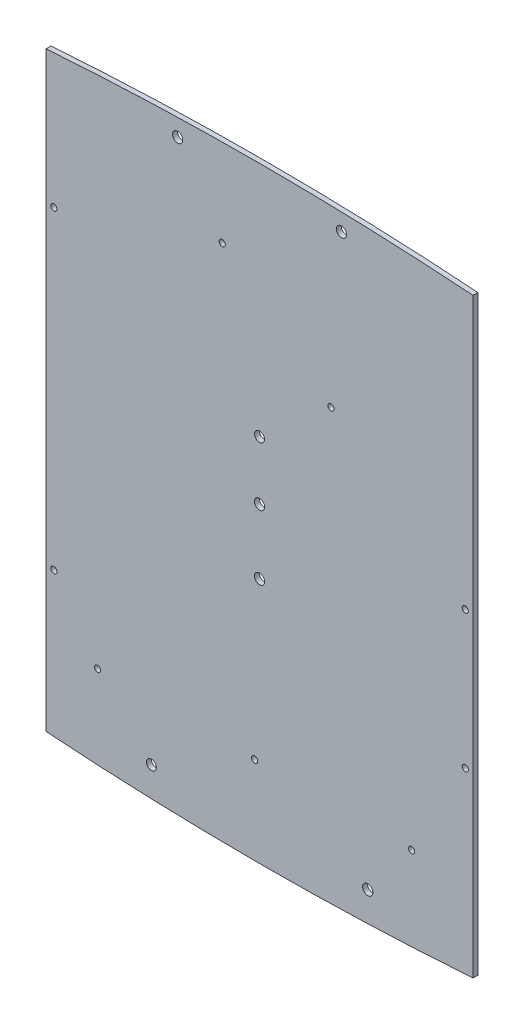
ISO-10303-21;
HEADER;
FILE_DESCRIPTION(('STEP AP214'),'2;1');
FILE_NAME('part.step','',(''),(''),'','','');
FILE_SCHEMA(('AUTOMOTIVE_DESIGN { 1 0 10303 214 1 1 1 1 }'));
ENDSEC;
DATA;
#1=APPLICATION_CONTEXT('core data for automotive mechanical design processes');
#2=APPLICATION_PROTOCOL_DEFINITION('international standard','automotive_design',2000,#1);
#3=PRODUCT_CONTEXT('',#1,'mechanical');
#4=PRODUCT('Part','Part','',(#3));
#5=PRODUCT_RELATED_PRODUCT_CATEGORY('part','',(#4));
#6=PRODUCT_DEFINITION_FORMATION('','',#4);
#7=PRODUCT_DEFINITION_CONTEXT('part definition',#1,'design');
#8=PRODUCT_DEFINITION('design','',#6,#7);
#9=PRODUCT_DEFINITION_SHAPE('','',#8);
#10=(LENGTH_UNIT() NAMED_UNIT(*) SI_UNIT(.MILLI.,.METRE.));
#11=(NAMED_UNIT(*) PLANE_ANGLE_UNIT() SI_UNIT($,.RADIAN.));
#12=(NAMED_UNIT(*) SI_UNIT($,.STERADIAN.) SOLID_ANGLE_UNIT());
#13=UNCERTAINTY_MEASURE_WITH_UNIT(LENGTH_MEASURE(1.E-05),#10,'distance_accuracy_value','');
#14=(GEOMETRIC_REPRESENTATION_CONTEXT(3) GLOBAL_UNCERTAINTY_ASSIGNED_CONTEXT((#13)) GLOBAL_UNIT_ASSIGNED_CONTEXT((#10,
#11,#12)) REPRESENTATION_CONTEXT('',''));
#15=CARTESIAN_POINT('',(0.,0.,0.));
#16=DIRECTION('',(0.,0.,1.));
#17=DIRECTION('',(1.,0.,0.));
#18=AXIS2_PLACEMENT_3D('',#15,#16,#17);
#19=CARTESIAN_POINT('',(0.,1739.49648769427,3.175));
#20=DIRECTION('',(0.,0.,1.));
#21=DIRECTION('',(1.,0.,0.));
#22=AXIS2_PLACEMENT_3D('',#19,#20,#21);
#23=PLANE('',#22);
#24=CARTESIAN_POINT('',(-104.775,-139.446,3.175));
#25=DIRECTION('',(0.,0.,1.));
#26=DIRECTION('',(1.,0.,0.));
#27=AXIS2_PLACEMENT_3D('',#24,#25,#26);
#28=CIRCLE('',#27,2.);
#29=CARTESIAN_POINT('',(-102.775,-139.446,3.175));
#30=VERTEX_POINT('',#29);
#31=EDGE_CURVE('E190',#30,#30,#28,.T.);
#32=ORIENTED_EDGE('',*,*,#31,.F.);
#33=EDGE_LOOP('',(#32));
#34=FACE_BOUND('',#33,.T.);
#35=CARTESIAN_POINT('',(-3.175,-139.446,3.175));
#36=DIRECTION('',(0.,0.,1.));
#37=DIRECTION('',(1.,0.,0.));
#38=AXIS2_PLACEMENT_3D('',#35,#36,#37);
#39=CIRCLE('',#38,2.);
#40=CARTESIAN_POINT('',(-1.175,-139.446,3.175));
#41=VERTEX_POINT('',#40);
#42=EDGE_CURVE('E178',#41,#41,#39,.T.);
#43=ORIENTED_EDGE('',*,*,#42,.F.);
#44=EDGE_LOOP('',(#43));
#45=FACE_BOUND('',#44,.T.);
#46=CARTESIAN_POINT('',(98.425,-139.446,3.175));
#47=DIRECTION('',(0.,0.,1.));
#48=DIRECTION('',(1.,0.,0.));
#49=AXIS2_PLACEMENT_3D('',#46,#47,#48);
#50=CIRCLE('',#49,2.);
#51=CARTESIAN_POINT('',(100.425,-139.446,3.175));
#52=VERTEX_POINT('',#51);
#53=EDGE_CURVE('E166',#52,#52,#50,.T.);
#54=ORIENTED_EDGE('',*,*,#53,.F.);
#55=EDGE_LOOP('',(#54));
#56=FACE_BOUND('',#55,.T.);
#57=CARTESIAN_POINT('',(133.096,12.7,3.175));
#58=DIRECTION('',(0.,0.,1.));
#59=DIRECTION('',(1.,0.,0.));
#60=AXIS2_PLACEMENT_3D('',#57,#58,#59);
#61=CIRCLE('',#60,2.);
#62=CARTESIAN_POINT('',(135.096,12.7,3.175));
#63=VERTEX_POINT('',#62);
#64=EDGE_CURVE('E154',#63,#63,#61,.T.);
#65=ORIENTED_EDGE('',*,*,#64,.F.);
#66=EDGE_LOOP('',(#65));
#67=FACE_BOUND('',#66,.T.);
#68=CARTESIAN_POINT('',(0.,5.15000000000001,3.175));
#69=DIRECTION('',(0.,0.,1.));
#70=DIRECTION('',(1.,0.,0.));
#71=AXIS2_PLACEMENT_3D('',#68,#69,#70);
#72=CIRCLE('',#71,3.3);
#73=CARTESIAN_POINT('',(3.3,5.15000000000001,3.175));
#74=VERTEX_POINT('',#73);
#75=EDGE_CURVE('E142',#74,#74,#72,.T.);
#76=ORIENTED_EDGE('',*,*,#75,.F.);
#77=EDGE_LOOP('',(#76));
#78=FACE_BOUND('',#77,.T.);
#79=CARTESIAN_POINT('',(-52.9999999999992,184.28,3.175));
#80=DIRECTION('',(0.,0.,1.));
#81=DIRECTION('',(1.,0.,0.));
#82=AXIS2_PLACEMENT_3D('',#79,#80,#81);
#83=CIRCLE('',#82,3.3);
#84=CARTESIAN_POINT('',(-49.6999999999992,184.28,3.175));
#85=VERTEX_POINT('',#84);
#86=EDGE_CURVE('E130',#85,#85,#83,.T.);
#87=ORIENTED_EDGE('',*,*,#86,.F.);
#88=EDGE_LOOP('',(#87));
#89=FACE_BOUND('',#88,.T.);
#90=CARTESIAN_POINT('',(-24.13,139.446,3.175));
#91=DIRECTION('',(0.,0.,1.));
#92=DIRECTION('',(1.,0.,0.));
#93=AXIS2_PLACEMENT_3D('',#90,#91,#92);
#94=CIRCLE('',#93,2.);
#95=CARTESIAN_POINT('',(-22.13,139.446,3.175));
#96=VERTEX_POINT('',#95);
#97=EDGE_CURVE('E118',#96,#96,#94,.T.);
#98=ORIENTED_EDGE('',*,*,#97,.F.);
#99=EDGE_LOOP('',(#98));
#100=FACE_BOUND('',#99,.T.);
#101=CARTESIAN_POINT('',(46.1772,82.55,3.175));
#102=DIRECTION('',(0.,0.,1.));
#103=DIRECTION('',(1.,0.,0.));
#104=AXIS2_PLACEMENT_3D('',#101,#102,#103);
#105=CIRCLE('',#104,2.);
#106=CARTESIAN_POINT('',(48.1772,82.55,3.175));
#107=VERTEX_POINT('',#106);
#108=EDGE_CURVE('E97',#107,#107,#105,.T.);
#109=ORIENTED_EDGE('',*,*,#108,.F.);
#110=EDGE_LOOP('',(#109));
#111=FACE_BOUND('',#110,.T.);
#112=CARTESIAN_POINT('',(0.,1739.49648769427,3.175));
#113=DIRECTION('',(0.,0.,1.));
#114=DIRECTION('',(1.,0.,0.));
#115=AXIS2_PLACEMENT_3D('',#112,#113,#114);
#116=CIRCLE('',#115,1935.68);
#117=CARTESIAN_POINT('',(-138.112499999999,-191.25,3.175));
#118=VERTEX_POINT('',#117);
#119=CARTESIAN_POINT('',(138.112500000001,-191.25,3.175));
#120=VERTEX_POINT('',#119);
#121=EDGE_CURVE('E82',#118,#120,#116,.T.);
#122=ORIENTED_EDGE('',*,*,#121,.T.);
#123=DIRECTION('',(0.,1.,0.));
#124=VECTOR('',#123,1.);
#125=CARTESIAN_POINT('',(138.1125,191.25,3.175));
#126=LINE('',#125,#124);
#127=CARTESIAN_POINT('',(138.1125,191.25,3.175));
#128=VERTEX_POINT('',#127);
#129=EDGE_CURVE('E77',#120,#128,#126,.T.);
#130=ORIENTED_EDGE('',*,*,#129,.T.);
#131=CARTESIAN_POINT('',(0.,-1739.49648769427,3.175));
#132=DIRECTION('',(0.,0.,1.));
#133=DIRECTION('',(1.,0.,0.));
#134=AXIS2_PLACEMENT_3D('',#131,#132,#133);
#135=CIRCLE('',#134,1935.68);
#136=CARTESIAN_POINT('',(-138.112500000001,191.25,3.175));
#137=VERTEX_POINT('',#136);
#138=EDGE_CURVE('E80',#128,#137,#135,.T.);
#139=ORIENTED_EDGE('',*,*,#138,.T.);
#140=DIRECTION('',(0.,-1.,0.));
#141=VECTOR('',#140,1.);
#142=CARTESIAN_POINT('',(-138.112499999999,-191.25,3.175));
#143=LINE('',#142,#141);
#144=EDGE_CURVE('E47',#137,#118,#143,.T.);
#145=ORIENTED_EDGE('',*,*,#144,.T.);
#146=EDGE_LOOP('',(#122,#130,#139,#145));
#147=FACE_BOUND('',#146,.T.);
#148=CARTESIAN_POINT('',(53.0000000000008,184.28,3.175));
#149=DIRECTION('',(0.,0.,1.));
#150=DIRECTION('',(1.,0.,0.));
#151=AXIS2_PLACEMENT_3D('',#148,#149,#150);
#152=CIRCLE('',#151,3.3);
#153=CARTESIAN_POINT('',(56.3000000000008,184.28,3.175));
#154=VERTEX_POINT('',#153);
#155=EDGE_CURVE('E112',#154,#154,#152,.T.);
#156=ORIENTED_EDGE('',*,*,#155,.F.);
#157=EDGE_LOOP('',(#156));
#158=FACE_BOUND('',#157,.T.);
#159=CARTESIAN_POINT('',(-133.096,104.936568767364,3.175));
#160=DIRECTION('',(0.,0.,1.));
#161=DIRECTION('',(1.,0.,0.));
#162=AXIS2_PLACEMENT_3D('',#159,#160,#161);
#163=CIRCLE('',#162,2.);
#164=CARTESIAN_POINT('',(-131.096,104.936568767364,3.175));
#165=VERTEX_POINT('',#164);
#166=EDGE_CURVE('E124',#165,#165,#163,.T.);
#167=ORIENTED_EDGE('',*,*,#166,.F.);
#168=EDGE_LOOP('',(#167));
#169=FACE_BOUND('',#168,.T.);
#170=CARTESIAN_POINT('',(0.,43.,3.175));
#171=DIRECTION('',(0.,0.,1.));
#172=DIRECTION('',(1.,0.,0.));
#173=AXIS2_PLACEMENT_3D('',#170,#171,#172);
#174=CIRCLE('',#173,3.2);
#175=CARTESIAN_POINT('',(3.2,43.,3.175));
#176=VERTEX_POINT('',#175);
#177=EDGE_CURVE('E136',#176,#176,#174,.T.);
#178=ORIENTED_EDGE('',*,*,#177,.F.);
#179=EDGE_LOOP('',(#178));
#180=FACE_BOUND('',#179,.T.);
#181=CARTESIAN_POINT('',(0.,-36.65,3.175));
#182=DIRECTION('',(0.,0.,1.));
#183=DIRECTION('',(1.,0.,0.));
#184=AXIS2_PLACEMENT_3D('',#181,#182,#183);
#185=CIRCLE('',#184,3.3);
#186=CARTESIAN_POINT('',(3.3,-36.65,3.175));
#187=VERTEX_POINT('',#186);
#188=EDGE_CURVE('E148',#187,#187,#185,.T.);
#189=ORIENTED_EDGE('',*,*,#188,.F.);
#190=EDGE_LOOP('',(#189));
#191=FACE_BOUND('',#190,.T.);
#192=CARTESIAN_POINT('',(133.096,-76.2,3.175));
#193=DIRECTION('',(0.,0.,1.));
#194=DIRECTION('',(1.,0.,0.));
#195=AXIS2_PLACEMENT_3D('',#192,#193,#194);
#196=CIRCLE('',#195,2.);
#197=CARTESIAN_POINT('',(135.096,-76.2,3.175));
#198=VERTEX_POINT('',#197);
#199=EDGE_CURVE('E160',#198,#198,#196,.T.);
#200=ORIENTED_EDGE('',*,*,#199,.F.);
#201=EDGE_LOOP('',(#200));
#202=FACE_BOUND('',#201,.T.);
#203=CARTESIAN_POINT('',(70.,-175.85,3.175));
#204=DIRECTION('',(0.,0.,1.));
#205=DIRECTION('',(1.,0.,0.));
#206=AXIS2_PLACEMENT_3D('',#203,#204,#205);
#207=CIRCLE('',#206,3.3);
#208=CARTESIAN_POINT('',(73.3,-175.85,3.175));
#209=VERTEX_POINT('',#208);
#210=EDGE_CURVE('E172',#209,#209,#207,.T.);
#211=ORIENTED_EDGE('',*,*,#210,.F.);
#212=EDGE_LOOP('',(#211));
#213=FACE_BOUND('',#212,.T.);
#214=CARTESIAN_POINT('',(-133.096,-98.2634312326355,3.175));
#215=DIRECTION('',(0.,0.,1.));
#216=DIRECTION('',(1.,0.,0.));
#217=AXIS2_PLACEMENT_3D('',#214,#215,#216);
#218=CIRCLE('',#217,2.);
#219=CARTESIAN_POINT('',(-131.096,-98.2634312326355,3.175));
#220=VERTEX_POINT('',#219);
#221=EDGE_CURVE('E184',#220,#220,#218,.T.);
#222=ORIENTED_EDGE('',*,*,#221,.F.);
#223=EDGE_LOOP('',(#222));
#224=FACE_BOUND('',#223,.T.);
#225=CARTESIAN_POINT('',(-70.,-175.85,3.175));
#226=DIRECTION('',(0.,0.,1.));
#227=DIRECTION('',(1.,0.,0.));
#228=AXIS2_PLACEMENT_3D('',#225,#226,#227);
#229=CIRCLE('',#228,3.2);
#230=CARTESIAN_POINT('',(-66.8,-175.85,3.175));
#231=VERTEX_POINT('',#230);
#232=EDGE_CURVE('E196',#231,#231,#229,.T.);
#233=ORIENTED_EDGE('',*,*,#232,.F.);
#234=EDGE_LOOP('',(#233));
#235=FACE_BOUND('',#234,.T.);
#236=ADVANCED_FACE('F30',(#34,#45,#56,#67,#78,#89,#100,#111,#147,#158,#169,#180,#191,#202,#213,
#224,#235),#23,.T.);
#237=CARTESIAN_POINT('',(0.,1739.49648769427,0.));
#238=DIRECTION('',(0.,0.,1.));
#239=DIRECTION('',(1.,0.,0.));
#240=AXIS2_PLACEMENT_3D('',#237,#238,#239);
#241=PLANE('',#240);
#242=CARTESIAN_POINT('',(-104.775,-139.446,0.));
#243=DIRECTION('',(0.,0.,1.));
#244=DIRECTION('',(1.,0.,0.));
#245=AXIS2_PLACEMENT_3D('',#242,#243,#244);
#246=CIRCLE('',#245,2.);
#247=CARTESIAN_POINT('',(-102.775,-139.446,0.));
#248=VERTEX_POINT('',#247);
#249=EDGE_CURVE('E193',#248,#248,#246,.T.);
#250=ORIENTED_EDGE('',*,*,#249,.T.);
#251=EDGE_LOOP('',(#250));
#252=FACE_BOUND('',#251,.T.);
#253=CARTESIAN_POINT('',(-3.175,-139.446,0.));
#254=DIRECTION('',(0.,0.,1.));
#255=DIRECTION('',(1.,0.,0.));
#256=AXIS2_PLACEMENT_3D('',#253,#254,#255);
#257=CIRCLE('',#256,2.);
#258=CARTESIAN_POINT('',(-1.175,-139.446,0.));
#259=VERTEX_POINT('',#258);
#260=EDGE_CURVE('E181',#259,#259,#257,.T.);
#261=ORIENTED_EDGE('',*,*,#260,.T.);
#262=EDGE_LOOP('',(#261));
#263=FACE_BOUND('',#262,.T.);
#264=CARTESIAN_POINT('',(98.425,-139.446,0.));
#265=DIRECTION('',(0.,0.,1.));
#266=DIRECTION('',(1.,0.,0.));
#267=AXIS2_PLACEMENT_3D('',#264,#265,#266);
#268=CIRCLE('',#267,2.);
#269=CARTESIAN_POINT('',(100.425,-139.446,0.));
#270=VERTEX_POINT('',#269);
#271=EDGE_CURVE('E169',#270,#270,#268,.T.);
#272=ORIENTED_EDGE('',*,*,#271,.T.);
#273=EDGE_LOOP('',(#272));
#274=FACE_BOUND('',#273,.T.);
#275=CARTESIAN_POINT('',(133.096,12.7,0.));
#276=DIRECTION('',(0.,0.,1.));
#277=DIRECTION('',(1.,0.,0.));
#278=AXIS2_PLACEMENT_3D('',#275,#276,#277);
#279=CIRCLE('',#278,2.);
#280=CARTESIAN_POINT('',(135.096,12.7,0.));
#281=VERTEX_POINT('',#280);
#282=EDGE_CURVE('E157',#281,#281,#279,.T.);
#283=ORIENTED_EDGE('',*,*,#282,.T.);
#284=EDGE_LOOP('',(#283));
#285=FACE_BOUND('',#284,.T.);
#286=CARTESIAN_POINT('',(0.,5.15000000000001,0.));
#287=DIRECTION('',(0.,0.,1.));
#288=DIRECTION('',(1.,0.,0.));
#289=AXIS2_PLACEMENT_3D('',#286,#287,#288);
#290=CIRCLE('',#289,3.3);
#291=CARTESIAN_POINT('',(3.3,5.15000000000001,0.));
#292=VERTEX_POINT('',#291);
#293=EDGE_CURVE('E145',#292,#292,#290,.T.);
#294=ORIENTED_EDGE('',*,*,#293,.T.);
#295=EDGE_LOOP('',(#294));
#296=FACE_BOUND('',#295,.T.);
#297=CARTESIAN_POINT('',(-52.9999999999992,184.28,0.));
#298=DIRECTION('',(0.,0.,1.));
#299=DIRECTION('',(1.,0.,0.));
#300=AXIS2_PLACEMENT_3D('',#297,#298,#299);
#301=CIRCLE('',#300,3.3);
#302=CARTESIAN_POINT('',(-49.6999999999992,184.28,0.));
#303=VERTEX_POINT('',#302);
#304=EDGE_CURVE('E133',#303,#303,#301,.T.);
#305=ORIENTED_EDGE('',*,*,#304,.T.);
#306=EDGE_LOOP('',(#305));
#307=FACE_BOUND('',#306,.T.);
#308=CARTESIAN_POINT('',(-24.13,139.446,0.));
#309=DIRECTION('',(0.,0.,1.));
#310=DIRECTION('',(1.,0.,0.));
#311=AXIS2_PLACEMENT_3D('',#308,#309,#310);
#312=CIRCLE('',#311,2.);
#313=CARTESIAN_POINT('',(-22.13,139.446,0.));
#314=VERTEX_POINT('',#313);
#315=EDGE_CURVE('E121',#314,#314,#312,.T.);
#316=ORIENTED_EDGE('',*,*,#315,.T.);
#317=EDGE_LOOP('',(#316));
#318=FACE_BOUND('',#317,.T.);
#319=CARTESIAN_POINT('',(46.1772,82.55,0.));
#320=DIRECTION('',(0.,0.,1.));
#321=DIRECTION('',(1.,0.,0.));
#322=AXIS2_PLACEMENT_3D('',#319,#320,#321);
#323=CIRCLE('',#322,2.);
#324=CARTESIAN_POINT('',(48.1772,82.55,0.));
#325=VERTEX_POINT('',#324);
#326=EDGE_CURVE('E109',#325,#325,#323,.T.);
#327=ORIENTED_EDGE('',*,*,#326,.T.);
#328=EDGE_LOOP('',(#327));
#329=FACE_BOUND('',#328,.T.);
#330=CARTESIAN_POINT('',(0.,1739.49648769427,0.));
#331=DIRECTION('',(0.,0.,1.));
#332=DIRECTION('',(1.,0.,0.));
#333=AXIS2_PLACEMENT_3D('',#330,#331,#332);
#334=CIRCLE('',#333,1935.68);
#335=CARTESIAN_POINT('',(-138.112499999999,-191.25,0.));
#336=VERTEX_POINT('',#335);
#337=CARTESIAN_POINT('',(138.112500000001,-191.25,0.));
#338=VERTEX_POINT('',#337);
#339=EDGE_CURVE('E94',#336,#338,#334,.T.);
#340=ORIENTED_EDGE('',*,*,#339,.F.);
#341=DIRECTION('',(0.,-1.,0.));
#342=VECTOR('',#341,1.);
#343=CARTESIAN_POINT('',(-138.112499999999,-191.25,0.));
#344=LINE('',#343,#342);
#345=CARTESIAN_POINT('',(-138.112500000001,191.25,0.));
#346=VERTEX_POINT('',#345);
#347=EDGE_CURVE('E70',#346,#336,#344,.T.);
#348=ORIENTED_EDGE('',*,*,#347,.F.);
#349=CARTESIAN_POINT('',(0.,-1739.49648769427,0.));
#350=DIRECTION('',(0.,0.,1.));
#351=DIRECTION('',(1.,0.,0.));
#352=AXIS2_PLACEMENT_3D('',#349,#350,#351);
#353=CIRCLE('',#352,1935.68);
#354=CARTESIAN_POINT('',(138.1125,191.25,0.));
#355=VERTEX_POINT('',#354);
#356=EDGE_CURVE('E64',#355,#346,#353,.T.);
#357=ORIENTED_EDGE('',*,*,#356,.F.);
#358=DIRECTION('',(0.,1.,0.));
#359=VECTOR('',#358,1.);
#360=CARTESIAN_POINT('',(138.1125,191.25,0.));
#361=LINE('',#360,#359);
#362=EDGE_CURVE('E86',#338,#355,#361,.T.);
#363=ORIENTED_EDGE('',*,*,#362,.F.);
#364=EDGE_LOOP('',(#340,#348,#357,#363));
#365=FACE_BOUND('',#364,.T.);
#366=CARTESIAN_POINT('',(53.0000000000008,184.28,0.));
#367=DIRECTION('',(0.,0.,1.));
#368=DIRECTION('',(1.,0.,0.));
#369=AXIS2_PLACEMENT_3D('',#366,#367,#368);
#370=CIRCLE('',#369,3.3);
#371=CARTESIAN_POINT('',(56.3000000000008,184.28,0.));
#372=VERTEX_POINT('',#371);
#373=EDGE_CURVE('E115',#372,#372,#370,.T.);
#374=ORIENTED_EDGE('',*,*,#373,.T.);
#375=EDGE_LOOP('',(#374));
#376=FACE_BOUND('',#375,.T.);
#377=CARTESIAN_POINT('',(-133.096,104.936568767364,0.));
#378=DIRECTION('',(0.,0.,1.));
#379=DIRECTION('',(1.,0.,0.));
#380=AXIS2_PLACEMENT_3D('',#377,#378,#379);
#381=CIRCLE('',#380,2.);
#382=CARTESIAN_POINT('',(-131.096,104.936568767364,0.));
#383=VERTEX_POINT('',#382);
#384=EDGE_CURVE('E127',#383,#383,#381,.T.);
#385=ORIENTED_EDGE('',*,*,#384,.T.);
#386=EDGE_LOOP('',(#385));
#387=FACE_BOUND('',#386,.T.);
#388=CARTESIAN_POINT('',(0.,43.,0.));
#389=DIRECTION('',(0.,0.,1.));
#390=DIRECTION('',(1.,0.,0.));
#391=AXIS2_PLACEMENT_3D('',#388,#389,#390);
#392=CIRCLE('',#391,3.2);
#393=CARTESIAN_POINT('',(3.2,43.,0.));
#394=VERTEX_POINT('',#393);
#395=EDGE_CURVE('E139',#394,#394,#392,.T.);
#396=ORIENTED_EDGE('',*,*,#395,.T.);
#397=EDGE_LOOP('',(#396));
#398=FACE_BOUND('',#397,.T.);
#399=CARTESIAN_POINT('',(0.,-36.65,0.));
#400=DIRECTION('',(0.,0.,1.));
#401=DIRECTION('',(1.,0.,0.));
#402=AXIS2_PLACEMENT_3D('',#399,#400,#401);
#403=CIRCLE('',#402,3.3);
#404=CARTESIAN_POINT('',(3.3,-36.65,0.));
#405=VERTEX_POINT('',#404);
#406=EDGE_CURVE('E151',#405,#405,#403,.T.);
#407=ORIENTED_EDGE('',*,*,#406,.T.);
#408=EDGE_LOOP('',(#407));
#409=FACE_BOUND('',#408,.T.);
#410=CARTESIAN_POINT('',(133.096,-76.2,0.));
#411=DIRECTION('',(0.,0.,1.));
#412=DIRECTION('',(1.,0.,0.));
#413=AXIS2_PLACEMENT_3D('',#410,#411,#412);
#414=CIRCLE('',#413,2.);
#415=CARTESIAN_POINT('',(135.096,-76.2,0.));
#416=VERTEX_POINT('',#415);
#417=EDGE_CURVE('E163',#416,#416,#414,.T.);
#418=ORIENTED_EDGE('',*,*,#417,.T.);
#419=EDGE_LOOP('',(#418));
#420=FACE_BOUND('',#419,.T.);
#421=CARTESIAN_POINT('',(70.,-175.85,0.));
#422=DIRECTION('',(0.,0.,1.));
#423=DIRECTION('',(1.,0.,0.));
#424=AXIS2_PLACEMENT_3D('',#421,#422,#423);
#425=CIRCLE('',#424,3.3);
#426=CARTESIAN_POINT('',(73.3,-175.85,0.));
#427=VERTEX_POINT('',#426);
#428=EDGE_CURVE('E175',#427,#427,#425,.T.);
#429=ORIENTED_EDGE('',*,*,#428,.T.);
#430=EDGE_LOOP('',(#429));
#431=FACE_BOUND('',#430,.T.);
#432=CARTESIAN_POINT('',(-133.096,-98.2634312326355,0.));
#433=DIRECTION('',(0.,0.,1.));
#434=DIRECTION('',(1.,0.,0.));
#435=AXIS2_PLACEMENT_3D('',#432,#433,#434);
#436=CIRCLE('',#435,2.);
#437=CARTESIAN_POINT('',(-131.096,-98.2634312326355,0.));
#438=VERTEX_POINT('',#437);
#439=EDGE_CURVE('E187',#438,#438,#436,.T.);
#440=ORIENTED_EDGE('',*,*,#439,.T.);
#441=EDGE_LOOP('',(#440));
#442=FACE_BOUND('',#441,.T.);
#443=CARTESIAN_POINT('',(-70.,-175.85,0.));
#444=DIRECTION('',(0.,0.,1.));
#445=DIRECTION('',(1.,0.,0.));
#446=AXIS2_PLACEMENT_3D('',#443,#444,#445);
#447=CIRCLE('',#446,3.2);
#448=CARTESIAN_POINT('',(-66.8,-175.85,0.));
#449=VERTEX_POINT('',#448);
#450=EDGE_CURVE('E199',#449,#449,#447,.T.);
#451=ORIENTED_EDGE('',*,*,#450,.T.);
#452=EDGE_LOOP('',(#451));
#453=FACE_BOUND('',#452,.T.);
#454=ADVANCED_FACE('F105',(#252,#263,#274,#285,#296,#307,#318,#329,#365,#376,#387,#398,#409,
#420,#431,#442,#453),#241,.F.);
#455=CARTESIAN_POINT('',(0.,1739.49648769427,3.175));
#456=DIRECTION('',(0.,0.,-1.));
#457=DIRECTION('',(-1.,0.,0.));
#458=AXIS2_PLACEMENT_3D('',#455,#456,#457);
#459=CYLINDRICAL_SURFACE('',#458,1935.68);
#460=ORIENTED_EDGE('',*,*,#339,.T.);
#461=DIRECTION('',(0.,0.,-1.));
#462=VECTOR('',#461,1.);
#463=CARTESIAN_POINT('',(138.112500000001,-191.25,3.175));
#464=LINE('',#463,#462);
#465=EDGE_CURVE('E11',#120,#338,#464,.T.);
#466=ORIENTED_EDGE('',*,*,#465,.F.);
#467=ORIENTED_EDGE('',*,*,#121,.F.);
#468=DIRECTION('',(0.,0.,-1.));
#469=VECTOR('',#468,1.);
#470=CARTESIAN_POINT('',(-138.112499999999,-191.25,3.175));
#471=LINE('',#470,#469);
#472=EDGE_CURVE('E90',#118,#336,#471,.T.);
#473=ORIENTED_EDGE('',*,*,#472,.T.);
#474=EDGE_LOOP('',(#460,#466,#467,#473));
#475=FACE_BOUND('',#474,.T.);
#476=ADVANCED_FACE('F32',(#475),#459,.T.);
#477=CARTESIAN_POINT('',(138.1125,191.25,3.175));
#478=DIRECTION('',(-1.,0.,0.));
#479=DIRECTION('',(0.,-1.,0.));
#480=AXIS2_PLACEMENT_3D('',#477,#478,#479);
#481=PLANE('',#480);
#482=ORIENTED_EDGE('',*,*,#362,.T.);
#483=DIRECTION('',(0.,0.,-1.));
#484=VECTOR('',#483,1.);
#485=CARTESIAN_POINT('',(138.1125,191.25,3.175));
#486=LINE('',#485,#484);
#487=EDGE_CURVE('E39',#128,#355,#486,.T.);
#488=ORIENTED_EDGE('',*,*,#487,.F.);
#489=ORIENTED_EDGE('',*,*,#129,.F.);
#490=ORIENTED_EDGE('',*,*,#465,.T.);
#491=EDGE_LOOP('',(#482,#488,#489,#490));
#492=FACE_BOUND('',#491,.T.);
#493=ADVANCED_FACE('F85',(#492),#481,.F.);
#494=CARTESIAN_POINT('',(0.,-1739.49648769427,3.175));
#495=DIRECTION('',(0.,0.,-1.));
#496=DIRECTION('',(-1.,0.,0.));
#497=AXIS2_PLACEMENT_3D('',#494,#495,#496);
#498=CYLINDRICAL_SURFACE('',#497,1935.68);
#499=ORIENTED_EDGE('',*,*,#356,.T.);
#500=DIRECTION('',(0.,0.,-1.));
#501=VECTOR('',#500,1.);
#502=CARTESIAN_POINT('',(-138.112500000001,191.25,3.175));
#503=LINE('',#502,#501);
#504=EDGE_CURVE('E87',#137,#346,#503,.T.);
#505=ORIENTED_EDGE('',*,*,#504,.F.);
#506=ORIENTED_EDGE('',*,*,#138,.F.);
#507=ORIENTED_EDGE('',*,*,#487,.T.);
#508=EDGE_LOOP('',(#499,#505,#506,#507));
#509=FACE_BOUND('',#508,.T.);
#510=ADVANCED_FACE('F88',(#509),#498,.T.);
#511=CARTESIAN_POINT('',(-138.112499999999,-191.25,3.175));
#512=DIRECTION('',(1.,0.,0.));
#513=DIRECTION('',(0.,1.,0.));
#514=AXIS2_PLACEMENT_3D('',#511,#512,#513);
#515=PLANE('',#514);
#516=ORIENTED_EDGE('',*,*,#347,.T.);
#517=ORIENTED_EDGE('',*,*,#472,.F.);
#518=ORIENTED_EDGE('',*,*,#144,.F.);
#519=ORIENTED_EDGE('',*,*,#504,.T.);
#520=EDGE_LOOP('',(#516,#517,#518,#519));
#521=FACE_BOUND('',#520,.T.);
#522=ADVANCED_FACE('F102',(#521),#515,.F.);
#523=CARTESIAN_POINT('',(46.1772,82.55,3.175));
#524=DIRECTION('',(0.,0.,-1.));
#525=DIRECTION('',(-1.,0.,0.));
#526=AXIS2_PLACEMENT_3D('',#523,#524,#525);
#527=CYLINDRICAL_SURFACE('',#526,2.);
#528=ORIENTED_EDGE('',*,*,#108,.T.);
#529=EDGE_LOOP('',(#528));
#530=FACE_BOUND('',#529,.T.);
#531=ORIENTED_EDGE('',*,*,#326,.F.);
#532=EDGE_LOOP('',(#531));
#533=FACE_BOUND('',#532,.T.);
#534=ADVANCED_FACE('F219',(#530,#533),#527,.F.);
#535=CARTESIAN_POINT('',(53.0000000000008,184.28,3.175));
#536=DIRECTION('',(0.,0.,-1.));
#537=DIRECTION('',(-1.,0.,0.));
#538=AXIS2_PLACEMENT_3D('',#535,#536,#537);
#539=CYLINDRICAL_SURFACE('',#538,3.3);
#540=ORIENTED_EDGE('',*,*,#155,.T.);
#541=EDGE_LOOP('',(#540));
#542=FACE_BOUND('',#541,.T.);
#543=ORIENTED_EDGE('',*,*,#373,.F.);
#544=EDGE_LOOP('',(#543));
#545=FACE_BOUND('',#544,.T.);
#546=ADVANCED_FACE('F265',(#542,#545),#539,.F.);
#547=CARTESIAN_POINT('',(-24.13,139.446,3.175));
#548=DIRECTION('',(0.,0.,-1.));
#549=DIRECTION('',(-1.,0.,0.));
#550=AXIS2_PLACEMENT_3D('',#547,#548,#549);
#551=CYLINDRICAL_SURFACE('',#550,2.);
#552=ORIENTED_EDGE('',*,*,#97,.T.);
#553=EDGE_LOOP('',(#552));
#554=FACE_BOUND('',#553,.T.);
#555=ORIENTED_EDGE('',*,*,#315,.F.);
#556=EDGE_LOOP('',(#555));
#557=FACE_BOUND('',#556,.T.);
#558=ADVANCED_FACE('F273',(#554,#557),#551,.F.);
#559=CARTESIAN_POINT('',(-133.096,104.936568767364,3.175));
#560=DIRECTION('',(0.,0.,-1.));
#561=DIRECTION('',(-1.,0.,0.));
#562=AXIS2_PLACEMENT_3D('',#559,#560,#561);
#563=CYLINDRICAL_SURFACE('',#562,2.);
#564=ORIENTED_EDGE('',*,*,#166,.T.);
#565=EDGE_LOOP('',(#564));
#566=FACE_BOUND('',#565,.T.);
#567=ORIENTED_EDGE('',*,*,#384,.F.);
#568=EDGE_LOOP('',(#567));
#569=FACE_BOUND('',#568,.T.);
#570=ADVANCED_FACE('F281',(#566,#569),#563,.F.);
#571=CARTESIAN_POINT('',(-52.9999999999992,184.28,3.175));
#572=DIRECTION('',(0.,0.,-1.));
#573=DIRECTION('',(-1.,0.,0.));
#574=AXIS2_PLACEMENT_3D('',#571,#572,#573);
#575=CYLINDRICAL_SURFACE('',#574,3.3);
#576=ORIENTED_EDGE('',*,*,#86,.T.);
#577=EDGE_LOOP('',(#576));
#578=FACE_BOUND('',#577,.T.);
#579=ORIENTED_EDGE('',*,*,#304,.F.);
#580=EDGE_LOOP('',(#579));
#581=FACE_BOUND('',#580,.T.);
#582=ADVANCED_FACE('F290',(#578,#581),#575,.F.);
#583=CARTESIAN_POINT('',(0.,43.,3.175));
#584=DIRECTION('',(0.,0.,-1.));
#585=DIRECTION('',(-1.,0.,0.));
#586=AXIS2_PLACEMENT_3D('',#583,#584,#585);
#587=CYLINDRICAL_SURFACE('',#586,3.2);
#588=ORIENTED_EDGE('',*,*,#177,.T.);
#589=EDGE_LOOP('',(#588));
#590=FACE_BOUND('',#589,.T.);
#591=ORIENTED_EDGE('',*,*,#395,.F.);
#592=EDGE_LOOP('',(#591));
#593=FACE_BOUND('',#592,.T.);
#594=ADVANCED_FACE('F299',(#590,#593),#587,.F.);
#595=CARTESIAN_POINT('',(0.,5.15000000000001,3.175));
#596=DIRECTION('',(0.,0.,-1.));
#597=DIRECTION('',(-1.,0.,0.));
#598=AXIS2_PLACEMENT_3D('',#595,#596,#597);
#599=CYLINDRICAL_SURFACE('',#598,3.3);
#600=ORIENTED_EDGE('',*,*,#75,.T.);
#601=EDGE_LOOP('',(#600));
#602=FACE_BOUND('',#601,.T.);
#603=ORIENTED_EDGE('',*,*,#293,.F.);
#604=EDGE_LOOP('',(#603));
#605=FACE_BOUND('',#604,.T.);
#606=ADVANCED_FACE('F308',(#602,#605),#599,.F.);
#607=CARTESIAN_POINT('',(0.,-36.65,3.175));
#608=DIRECTION('',(0.,0.,-1.));
#609=DIRECTION('',(-1.,0.,0.));
#610=AXIS2_PLACEMENT_3D('',#607,#608,#609);
#611=CYLINDRICAL_SURFACE('',#610,3.3);
#612=ORIENTED_EDGE('',*,*,#188,.T.);
#613=EDGE_LOOP('',(#612));
#614=FACE_BOUND('',#613,.T.);
#615=ORIENTED_EDGE('',*,*,#406,.F.);
#616=EDGE_LOOP('',(#615));
#617=FACE_BOUND('',#616,.T.);
#618=ADVANCED_FACE('F317',(#614,#617),#611,.F.);
#619=CARTESIAN_POINT('',(133.096,12.7,3.175));
#620=DIRECTION('',(0.,0.,-1.));
#621=DIRECTION('',(-1.,0.,0.));
#622=AXIS2_PLACEMENT_3D('',#619,#620,#621);
#623=CYLINDRICAL_SURFACE('',#622,2.);
#624=ORIENTED_EDGE('',*,*,#64,.T.);
#625=EDGE_LOOP('',(#624));
#626=FACE_BOUND('',#625,.T.);
#627=ORIENTED_EDGE('',*,*,#282,.F.);
#628=EDGE_LOOP('',(#627));
#629=FACE_BOUND('',#628,.T.);
#630=ADVANCED_FACE('F326',(#626,#629),#623,.F.);
#631=CARTESIAN_POINT('',(133.096,-76.2,3.175));
#632=DIRECTION('',(0.,0.,-1.));
#633=DIRECTION('',(-1.,0.,0.));
#634=AXIS2_PLACEMENT_3D('',#631,#632,#633);
#635=CYLINDRICAL_SURFACE('',#634,2.);
#636=ORIENTED_EDGE('',*,*,#199,.T.);
#637=EDGE_LOOP('',(#636));
#638=FACE_BOUND('',#637,.T.);
#639=ORIENTED_EDGE('',*,*,#417,.F.);
#640=EDGE_LOOP('',(#639));
#641=FACE_BOUND('',#640,.T.);
#642=ADVANCED_FACE('F335',(#638,#641),#635,.F.);
#643=CARTESIAN_POINT('',(98.425,-139.446,3.175));
#644=DIRECTION('',(0.,0.,-1.));
#645=DIRECTION('',(-1.,0.,0.));
#646=AXIS2_PLACEMENT_3D('',#643,#644,#645);
#647=CYLINDRICAL_SURFACE('',#646,2.);
#648=ORIENTED_EDGE('',*,*,#53,.T.);
#649=EDGE_LOOP('',(#648));
#650=FACE_BOUND('',#649,.T.);
#651=ORIENTED_EDGE('',*,*,#271,.F.);
#652=EDGE_LOOP('',(#651));
#653=FACE_BOUND('',#652,.T.);
#654=ADVANCED_FACE('F344',(#650,#653),#647,.F.);
#655=CARTESIAN_POINT('',(70.,-175.85,3.175));
#656=DIRECTION('',(0.,0.,-1.));
#657=DIRECTION('',(-1.,0.,0.));
#658=AXIS2_PLACEMENT_3D('',#655,#656,#657);
#659=CYLINDRICAL_SURFACE('',#658,3.3);
#660=ORIENTED_EDGE('',*,*,#210,.T.);
#661=EDGE_LOOP('',(#660));
#662=FACE_BOUND('',#661,.T.);
#663=ORIENTED_EDGE('',*,*,#428,.F.);
#664=EDGE_LOOP('',(#663));
#665=FACE_BOUND('',#664,.T.);
#666=ADVANCED_FACE('F353',(#662,#665),#659,.F.);
#667=CARTESIAN_POINT('',(-3.175,-139.446,3.175));
#668=DIRECTION('',(0.,0.,-1.));
#669=DIRECTION('',(-1.,0.,0.));
#670=AXIS2_PLACEMENT_3D('',#667,#668,#669);
#671=CYLINDRICAL_SURFACE('',#670,2.);
#672=ORIENTED_EDGE('',*,*,#42,.T.);
#673=EDGE_LOOP('',(#672));
#674=FACE_BOUND('',#673,.T.);
#675=ORIENTED_EDGE('',*,*,#260,.F.);
#676=EDGE_LOOP('',(#675));
#677=FACE_BOUND('',#676,.T.);
#678=ADVANCED_FACE('F362',(#674,#677),#671,.F.);
#679=CARTESIAN_POINT('',(-133.096,-98.2634312326355,3.175));
#680=DIRECTION('',(0.,0.,-1.));
#681=DIRECTION('',(-1.,0.,0.));
#682=AXIS2_PLACEMENT_3D('',#679,#680,#681);
#683=CYLINDRICAL_SURFACE('',#682,2.);
#684=ORIENTED_EDGE('',*,*,#221,.T.);
#685=EDGE_LOOP('',(#684));
#686=FACE_BOUND('',#685,.T.);
#687=ORIENTED_EDGE('',*,*,#439,.F.);
#688=EDGE_LOOP('',(#687));
#689=FACE_BOUND('',#688,.T.);
#690=ADVANCED_FACE('F371',(#686,#689),#683,.F.);
#691=CARTESIAN_POINT('',(-104.775,-139.446,3.175));
#692=DIRECTION('',(0.,0.,-1.));
#693=DIRECTION('',(-1.,0.,0.));
#694=AXIS2_PLACEMENT_3D('',#691,#692,#693);
#695=CYLINDRICAL_SURFACE('',#694,2.);
#696=ORIENTED_EDGE('',*,*,#31,.T.);
#697=EDGE_LOOP('',(#696));
#698=FACE_BOUND('',#697,.T.);
#699=ORIENTED_EDGE('',*,*,#249,.F.);
#700=EDGE_LOOP('',(#699));
#701=FACE_BOUND('',#700,.T.);
#702=ADVANCED_FACE('F380',(#698,#701),#695,.F.);
#703=CARTESIAN_POINT('',(-70.,-175.85,3.175));
#704=DIRECTION('',(0.,0.,-1.));
#705=DIRECTION('',(-1.,0.,0.));
#706=AXIS2_PLACEMENT_3D('',#703,#704,#705);
#707=CYLINDRICAL_SURFACE('',#706,3.2);
#708=ORIENTED_EDGE('',*,*,#232,.T.);
#709=EDGE_LOOP('',(#708));
#710=FACE_BOUND('',#709,.T.);
#711=ORIENTED_EDGE('',*,*,#450,.F.);
#712=EDGE_LOOP('',(#711));
#713=FACE_BOUND('',#712,.T.);
#714=ADVANCED_FACE('F205',(#710,#713),#707,.F.);
#715=CLOSED_SHELL('',(#236,#454,#476,#493,#510,#522,#534,#546,#558,#570,#582,#594,#606,#618,
#630,#642,#654,#666,#678,#690,#702,#714));
#716=MANIFOLD_SOLID_BREP('B2',#715);
#717=ADVANCED_BREP_SHAPE_REPRESENTATION('',(#18,#716),#14);
#718=SHAPE_DEFINITION_REPRESENTATION(#9,#717);
ENDSEC;
END-ISO-10303-21;
